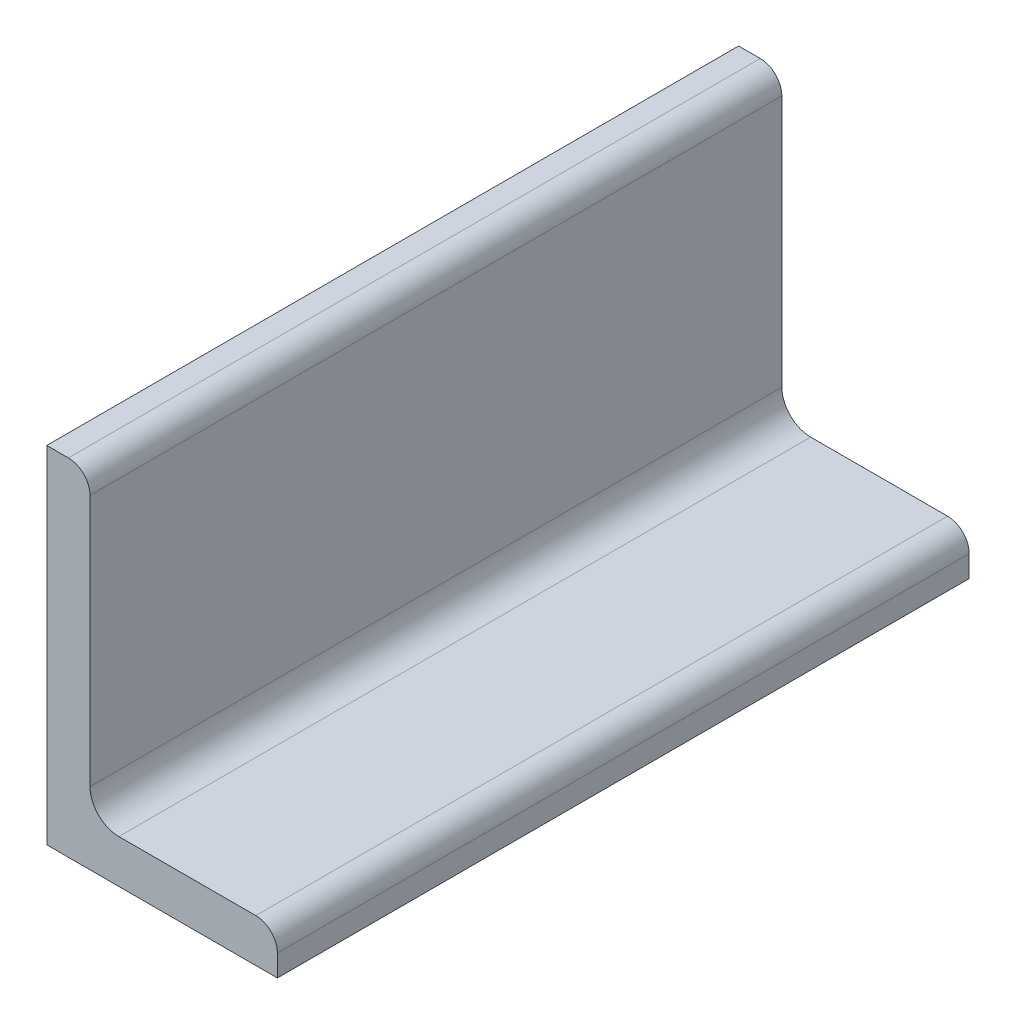
ISO-10303-21;
HEADER;
FILE_DESCRIPTION(('STEP AP214'),'2;1');
FILE_NAME('part.step','',(''),(''),'','','');
FILE_SCHEMA(('AUTOMOTIVE_DESIGN { 1 0 10303 214 1 1 1 1 }'));
ENDSEC;
DATA;
#1=APPLICATION_CONTEXT('core data for automotive mechanical design processes');
#2=APPLICATION_PROTOCOL_DEFINITION('international standard','automotive_design',2000,#1);
#3=PRODUCT_CONTEXT('',#1,'mechanical');
#4=PRODUCT('Part','Part','',(#3));
#5=PRODUCT_RELATED_PRODUCT_CATEGORY('part','',(#4));
#6=PRODUCT_DEFINITION_FORMATION('','',#4);
#7=PRODUCT_DEFINITION_CONTEXT('part definition',#1,'design');
#8=PRODUCT_DEFINITION('design','',#6,#7);
#9=PRODUCT_DEFINITION_SHAPE('','',#8);
#10=(LENGTH_UNIT() NAMED_UNIT(*) SI_UNIT(.MILLI.,.METRE.));
#11=(NAMED_UNIT(*) PLANE_ANGLE_UNIT() SI_UNIT($,.RADIAN.));
#12=(NAMED_UNIT(*) SI_UNIT($,.STERADIAN.) SOLID_ANGLE_UNIT());
#13=UNCERTAINTY_MEASURE_WITH_UNIT(LENGTH_MEASURE(1.E-05),#10,'distance_accuracy_value','');
#14=(GEOMETRIC_REPRESENTATION_CONTEXT(3) GLOBAL_UNCERTAINTY_ASSIGNED_CONTEXT((#13)) GLOBAL_UNIT_ASSIGNED_CONTEXT((#10,
#11,#12)) REPRESENTATION_CONTEXT('',''));
#15=CARTESIAN_POINT('',(0.,0.,0.));
#16=DIRECTION('',(0.,0.,1.));
#17=DIRECTION('',(1.,0.,0.));
#18=AXIS2_PLACEMENT_3D('',#15,#16,#17);
#19=CARTESIAN_POINT('',(0.865045893659089,152.925428131371,304.8));
#20=DIRECTION('',(1.,0.,0.));
#21=DIRECTION('',(0.,0.,-1.));
#22=AXIS2_PLACEMENT_3D('',#19,#20,#21);
#23=PLANE('',#22);
#24=DIRECTION('',(0.,-1.,0.));
#25=VECTOR('',#24,1.);
#26=CARTESIAN_POINT('',(0.865045893659089,152.925428131371,0.));
#27=LINE('',#26,#25);
#28=CARTESIAN_POINT('',(0.865045893659089,152.925428131371,0.));
#29=VERTEX_POINT('',#28);
#30=CARTESIAN_POINT('',(0.865045893659089,0.525428131371291,0.));
#31=VERTEX_POINT('',#30);
#32=EDGE_CURVE('E135',#29,#31,#27,.T.);
#33=ORIENTED_EDGE('',*,*,#32,.T.);
#34=DIRECTION('',(0.,0.,-1.));
#35=VECTOR('',#34,1.);
#36=CARTESIAN_POINT('',(0.865045893659089,0.525428131371291,304.8));
#37=LINE('',#36,#35);
#38=CARTESIAN_POINT('',(0.865045893659089,0.525428131371291,304.8));
#39=VERTEX_POINT('',#38);
#40=EDGE_CURVE('E11',#39,#31,#37,.T.);
#41=ORIENTED_EDGE('',*,*,#40,.F.);
#42=DIRECTION('',(0.,-1.,0.));
#43=VECTOR('',#42,1.);
#44=CARTESIAN_POINT('',(0.865045893659089,152.925428131371,304.8));
#45=LINE('',#44,#43);
#46=CARTESIAN_POINT('',(0.865045893659089,152.925428131371,304.8));
#47=VERTEX_POINT('',#46);
#48=EDGE_CURVE('E151',#47,#39,#45,.T.);
#49=ORIENTED_EDGE('',*,*,#48,.F.);
#50=DIRECTION('',(0.,0.,-1.));
#51=VECTOR('',#50,1.);
#52=CARTESIAN_POINT('',(0.865045893659089,152.925428131371,304.8));
#53=LINE('',#52,#51);
#54=EDGE_CURVE('E131',#47,#29,#53,.T.);
#55=ORIENTED_EDGE('',*,*,#54,.T.);
#56=EDGE_LOOP('',(#33,#41,#49,#55));
#57=FACE_BOUND('',#56,.T.);
#58=ADVANCED_FACE('F33',(#57),#23,.F.);
#59=CARTESIAN_POINT('',(0.865045893659089,0.525428131371291,304.8));
#60=DIRECTION('',(0.,1.,0.));
#61=DIRECTION('',(0.,0.,1.));
#62=AXIS2_PLACEMENT_3D('',#59,#60,#61);
#63=PLANE('',#62);
#64=DIRECTION('',(1.,0.,0.));
#65=VECTOR('',#64,1.);
#66=CARTESIAN_POINT('',(0.865045893659089,0.525428131371291,0.));
#67=LINE('',#66,#65);
#68=CARTESIAN_POINT('',(102.465045893659,0.525428131371291,0.));
#69=VERTEX_POINT('',#68);
#70=EDGE_CURVE('E138',#31,#69,#67,.T.);
#71=ORIENTED_EDGE('',*,*,#70,.T.);
#72=DIRECTION('',(0.,0.,-1.));
#73=VECTOR('',#72,1.);
#74=CARTESIAN_POINT('',(102.465045893659,0.525428131371291,304.8));
#75=LINE('',#74,#73);
#76=CARTESIAN_POINT('',(102.465045893659,0.525428131371291,304.8));
#77=VERTEX_POINT('',#76);
#78=EDGE_CURVE('E41',#77,#69,#75,.T.);
#79=ORIENTED_EDGE('',*,*,#78,.F.);
#80=DIRECTION('',(1.,0.,0.));
#81=VECTOR('',#80,1.);
#82=CARTESIAN_POINT('',(0.865045893659089,0.525428131371291,304.8));
#83=LINE('',#82,#81);
#84=EDGE_CURVE('E95',#39,#77,#83,.T.);
#85=ORIENTED_EDGE('',*,*,#84,.F.);
#86=ORIENTED_EDGE('',*,*,#40,.T.);
#87=EDGE_LOOP('',(#71,#79,#85,#86));
#88=FACE_BOUND('',#87,.T.);
#89=ADVANCED_FACE('F194',(#88),#63,.F.);
#90=CARTESIAN_POINT('',(102.465045893659,0.525428131371291,304.8));
#91=DIRECTION('',(-1.,0.,0.));
#92=DIRECTION('',(0.,0.,1.));
#93=AXIS2_PLACEMENT_3D('',#90,#91,#92);
#94=PLANE('',#93);
#95=DIRECTION('',(0.,1.,0.));
#96=VECTOR('',#95,1.);
#97=CARTESIAN_POINT('',(102.465045893659,0.525428131371291,0.));
#98=LINE('',#97,#96);
#99=CARTESIAN_POINT('',(102.465045893659,10.0504281313713,0.));
#100=VERTEX_POINT('',#99);
#101=EDGE_CURVE('E140',#69,#100,#98,.T.);
#102=ORIENTED_EDGE('',*,*,#101,.T.);
#103=DIRECTION('',(0.,0.,-1.));
#104=VECTOR('',#103,1.);
#105=CARTESIAN_POINT('',(102.465045893659,10.0504281313713,304.8));
#106=LINE('',#105,#104);
#107=CARTESIAN_POINT('',(102.465045893659,10.0504281313713,304.8));
#108=VERTEX_POINT('',#107);
#109=EDGE_CURVE('E161',#108,#100,#106,.T.);
#110=ORIENTED_EDGE('',*,*,#109,.F.);
#111=DIRECTION('',(0.,1.,0.));
#112=VECTOR('',#111,1.);
#113=CARTESIAN_POINT('',(102.465045893659,0.525428131371291,304.8));
#114=LINE('',#113,#112);
#115=EDGE_CURVE('E169',#77,#108,#114,.T.);
#116=ORIENTED_EDGE('',*,*,#115,.F.);
#117=ORIENTED_EDGE('',*,*,#78,.T.);
#118=EDGE_LOOP('',(#102,#110,#116,#117));
#119=FACE_BOUND('',#118,.T.);
#120=ADVANCED_FACE('F167',(#119),#94,.F.);
#121=CARTESIAN_POINT('',(92.9400458936591,10.0504281313713,304.8));
#122=DIRECTION('',(0.,0.,-1.));
#123=DIRECTION('',(-1.,0.,0.));
#124=AXIS2_PLACEMENT_3D('',#121,#122,#123);
#125=CYLINDRICAL_SURFACE('',#124,9.52500000000001);
#126=CARTESIAN_POINT('',(92.9400458936591,10.0504281313713,0.));
#127=DIRECTION('',(0.,0.,1.));
#128=DIRECTION('',(1.,0.,0.));
#129=AXIS2_PLACEMENT_3D('',#126,#127,#128);
#130=CIRCLE('',#129,9.52500000000001);
#131=CARTESIAN_POINT('',(92.9400458936591,19.5754281313713,0.));
#132=VERTEX_POINT('',#131);
#133=EDGE_CURVE('E142',#100,#132,#130,.T.);
#134=ORIENTED_EDGE('',*,*,#133,.T.);
#135=DIRECTION('',(0.,0.,-1.));
#136=VECTOR('',#135,1.);
#137=CARTESIAN_POINT('',(92.9400458936591,19.5754281313713,304.8));
#138=LINE('',#137,#136);
#139=CARTESIAN_POINT('',(92.9400458936591,19.5754281313713,304.8));
#140=VERTEX_POINT('',#139);
#141=EDGE_CURVE('E158',#140,#132,#138,.T.);
#142=ORIENTED_EDGE('',*,*,#141,.F.);
#143=CARTESIAN_POINT('',(92.9400458936591,10.0504281313713,304.8));
#144=DIRECTION('',(0.,0.,1.));
#145=DIRECTION('',(1.,0.,0.));
#146=AXIS2_PLACEMENT_3D('',#143,#144,#145);
#147=CIRCLE('',#146,9.52500000000001);
#148=EDGE_CURVE('E185',#108,#140,#147,.T.);
#149=ORIENTED_EDGE('',*,*,#148,.F.);
#150=ORIENTED_EDGE('',*,*,#109,.T.);
#151=EDGE_LOOP('',(#134,#142,#149,#150));
#152=FACE_BOUND('',#151,.T.);
#153=ADVANCED_FACE('F178',(#152),#125,.T.);
#154=CARTESIAN_POINT('',(92.9400458936591,19.5754281313713,304.8));
#155=DIRECTION('',(0.,-1.,0.));
#156=DIRECTION('',(0.,0.,-1.));
#157=AXIS2_PLACEMENT_3D('',#154,#155,#156);
#158=PLANE('',#157);
#159=DIRECTION('',(-1.,0.,0.));
#160=VECTOR('',#159,1.);
#161=CARTESIAN_POINT('',(92.9400458936591,19.5754281313713,0.));
#162=LINE('',#161,#160);
#163=CARTESIAN_POINT('',(32.6150458936591,19.5754281313713,0.));
#164=VERTEX_POINT('',#163);
#165=EDGE_CURVE('E144',#132,#164,#162,.T.);
#166=ORIENTED_EDGE('',*,*,#165,.T.);
#167=DIRECTION('',(0.,0.,-1.));
#168=VECTOR('',#167,1.);
#169=CARTESIAN_POINT('',(32.6150458936591,19.5754281313713,304.8));
#170=LINE('',#169,#168);
#171=CARTESIAN_POINT('',(32.6150458936591,19.5754281313713,304.8));
#172=VERTEX_POINT('',#171);
#173=EDGE_CURVE('E155',#172,#164,#170,.T.);
#174=ORIENTED_EDGE('',*,*,#173,.F.);
#175=DIRECTION('',(-1.,0.,0.));
#176=VECTOR('',#175,1.);
#177=CARTESIAN_POINT('',(92.9400458936591,19.5754281313713,304.8));
#178=LINE('',#177,#176);
#179=EDGE_CURVE('E184',#140,#172,#178,.T.);
#180=ORIENTED_EDGE('',*,*,#179,.F.);
#181=ORIENTED_EDGE('',*,*,#141,.T.);
#182=EDGE_LOOP('',(#166,#174,#180,#181));
#183=FACE_BOUND('',#182,.T.);
#184=ADVANCED_FACE('F182',(#183),#158,.F.);
#185=CARTESIAN_POINT('',(32.6150458936591,32.2754281313713,304.8));
#186=DIRECTION('',(0.,0.,-1.));
#187=DIRECTION('',(-1.,0.,0.));
#188=AXIS2_PLACEMENT_3D('',#185,#186,#187);
#189=CYLINDRICAL_SURFACE('',#188,12.7);
#190=CARTESIAN_POINT('',(32.6150458936591,32.2754281313713,0.));
#191=DIRECTION('',(0.,0.,-1.));
#192=DIRECTION('',(1.,0.,0.));
#193=AXIS2_PLACEMENT_3D('',#190,#191,#192);
#194=CIRCLE('',#193,12.7);
#195=CARTESIAN_POINT('',(19.9150458936591,32.2754281313713,0.));
#196=VERTEX_POINT('',#195);
#197=EDGE_CURVE('E146',#164,#196,#194,.T.);
#198=ORIENTED_EDGE('',*,*,#197,.T.);
#199=DIRECTION('',(0.,0.,-1.));
#200=VECTOR('',#199,1.);
#201=CARTESIAN_POINT('',(19.9150458936591,32.2754281313713,304.8));
#202=LINE('',#201,#200);
#203=CARTESIAN_POINT('',(19.9150458936591,32.2754281313713,304.8));
#204=VERTEX_POINT('',#203);
#205=EDGE_CURVE('E126',#204,#196,#202,.T.);
#206=ORIENTED_EDGE('',*,*,#205,.F.);
#207=CARTESIAN_POINT('',(32.6150458936591,32.2754281313713,304.8));
#208=DIRECTION('',(0.,0.,-1.));
#209=DIRECTION('',(1.,0.,0.));
#210=AXIS2_PLACEMENT_3D('',#207,#208,#209);
#211=CIRCLE('',#210,12.7);
#212=EDGE_CURVE('E117',#172,#204,#211,.T.);
#213=ORIENTED_EDGE('',*,*,#212,.F.);
#214=ORIENTED_EDGE('',*,*,#173,.T.);
#215=EDGE_LOOP('',(#198,#206,#213,#214));
#216=FACE_BOUND('',#215,.T.);
#217=ADVANCED_FACE('F206',(#216),#189,.F.);
#218=CARTESIAN_POINT('',(19.9150458936591,32.2754281313713,304.8));
#219=DIRECTION('',(-1.,0.,0.));
#220=DIRECTION('',(0.,0.,1.));
#221=AXIS2_PLACEMENT_3D('',#218,#219,#220);
#222=PLANE('',#221);
#223=DIRECTION('',(0.,1.,0.));
#224=VECTOR('',#223,1.);
#225=CARTESIAN_POINT('',(19.9150458936591,32.2754281313713,0.));
#226=LINE('',#225,#224);
#227=CARTESIAN_POINT('',(19.9150458936591,143.400428131371,0.));
#228=VERTEX_POINT('',#227);
#229=EDGE_CURVE('E125',#196,#228,#226,.T.);
#230=ORIENTED_EDGE('',*,*,#229,.T.);
#231=DIRECTION('',(0.,0.,-1.));
#232=VECTOR('',#231,1.);
#233=CARTESIAN_POINT('',(19.9150458936591,143.400428131371,304.8));
#234=LINE('',#233,#232);
#235=CARTESIAN_POINT('',(19.9150458936591,143.400428131371,304.8));
#236=VERTEX_POINT('',#235);
#237=EDGE_CURVE('E122',#236,#228,#234,.T.);
#238=ORIENTED_EDGE('',*,*,#237,.F.);
#239=DIRECTION('',(0.,1.,0.));
#240=VECTOR('',#239,1.);
#241=CARTESIAN_POINT('',(19.9150458936591,32.2754281313713,304.8));
#242=LINE('',#241,#240);
#243=EDGE_CURVE('E111',#204,#236,#242,.T.);
#244=ORIENTED_EDGE('',*,*,#243,.F.);
#245=ORIENTED_EDGE('',*,*,#205,.T.);
#246=EDGE_LOOP('',(#230,#238,#244,#245));
#247=FACE_BOUND('',#246,.T.);
#248=ADVANCED_FACE('F123',(#247),#222,.F.);
#249=CARTESIAN_POINT('',(10.3900458936591,143.400428131371,304.8));
#250=DIRECTION('',(0.,0.,-1.));
#251=DIRECTION('',(-1.,0.,0.));
#252=AXIS2_PLACEMENT_3D('',#249,#250,#251);
#253=CYLINDRICAL_SURFACE('',#252,9.525);
#254=CARTESIAN_POINT('',(10.3900458936591,143.400428131371,0.));
#255=DIRECTION('',(0.,0.,1.));
#256=DIRECTION('',(1.,0.,0.));
#257=AXIS2_PLACEMENT_3D('',#254,#255,#256);
#258=CIRCLE('',#257,9.525);
#259=CARTESIAN_POINT('',(10.3900458936591,152.925428131371,0.));
#260=VERTEX_POINT('',#259);
#261=EDGE_CURVE('E81',#228,#260,#258,.T.);
#262=ORIENTED_EDGE('',*,*,#261,.T.);
#263=DIRECTION('',(0.,0.,-1.));
#264=VECTOR('',#263,1.);
#265=CARTESIAN_POINT('',(10.3900458936591,152.925428131371,304.8));
#266=LINE('',#265,#264);
#267=CARTESIAN_POINT('',(10.3900458936591,152.925428131371,304.8));
#268=VERTEX_POINT('',#267);
#269=EDGE_CURVE('E127',#268,#260,#266,.T.);
#270=ORIENTED_EDGE('',*,*,#269,.F.);
#271=CARTESIAN_POINT('',(10.3900458936591,143.400428131371,304.8));
#272=DIRECTION('',(0.,0.,1.));
#273=DIRECTION('',(1.,0.,0.));
#274=AXIS2_PLACEMENT_3D('',#271,#272,#273);
#275=CIRCLE('',#274,9.525);
#276=EDGE_CURVE('E115',#236,#268,#275,.T.);
#277=ORIENTED_EDGE('',*,*,#276,.F.);
#278=ORIENTED_EDGE('',*,*,#237,.T.);
#279=EDGE_LOOP('',(#262,#270,#277,#278));
#280=FACE_BOUND('',#279,.T.);
#281=ADVANCED_FACE('F129',(#280),#253,.T.);
#282=CARTESIAN_POINT('',(10.3900458936591,152.925428131371,304.8));
#283=DIRECTION('',(0.,-1.,0.));
#284=DIRECTION('',(0.,0.,-1.));
#285=AXIS2_PLACEMENT_3D('',#282,#283,#284);
#286=PLANE('',#285);
#287=DIRECTION('',(-1.,0.,0.));
#288=VECTOR('',#287,1.);
#289=CARTESIAN_POINT('',(10.3900458936591,152.925428131371,0.));
#290=LINE('',#289,#288);
#291=EDGE_CURVE('E87',#260,#29,#290,.T.);
#292=ORIENTED_EDGE('',*,*,#291,.T.);
#293=ORIENTED_EDGE('',*,*,#54,.F.);
#294=DIRECTION('',(-1.,0.,0.));
#295=VECTOR('',#294,1.);
#296=CARTESIAN_POINT('',(10.3900458936591,152.925428131371,304.8));
#297=LINE('',#296,#295);
#298=EDGE_CURVE('E49',#268,#47,#297,.T.);
#299=ORIENTED_EDGE('',*,*,#298,.F.);
#300=ORIENTED_EDGE('',*,*,#269,.T.);
#301=EDGE_LOOP('',(#292,#293,#299,#300));
#302=FACE_BOUND('',#301,.T.);
#303=ADVANCED_FACE('F214',(#302),#286,.F.);
#304=CARTESIAN_POINT('',(92.9400458936591,10.0504281313713,304.8));
#305=DIRECTION('',(0.,0.,1.));
#306=DIRECTION('',(1.,0.,0.));
#307=AXIS2_PLACEMENT_3D('',#304,#305,#306);
#308=PLANE('',#307);
#309=ORIENTED_EDGE('',*,*,#48,.T.);
#310=ORIENTED_EDGE('',*,*,#84,.T.);
#311=ORIENTED_EDGE('',*,*,#115,.T.);
#312=ORIENTED_EDGE('',*,*,#148,.T.);
#313=ORIENTED_EDGE('',*,*,#179,.T.);
#314=ORIENTED_EDGE('',*,*,#212,.T.);
#315=ORIENTED_EDGE('',*,*,#243,.T.);
#316=ORIENTED_EDGE('',*,*,#276,.T.);
#317=ORIENTED_EDGE('',*,*,#298,.T.);
#318=EDGE_LOOP('',(#309,#310,#311,#312,#313,#314,#315,#316,#317));
#319=FACE_BOUND('',#318,.T.);
#320=ADVANCED_FACE('F113',(#319),#308,.T.);
#321=CARTESIAN_POINT('',(92.9400458936591,10.0504281313713,0.));
#322=DIRECTION('',(0.,0.,1.));
#323=DIRECTION('',(1.,0.,0.));
#324=AXIS2_PLACEMENT_3D('',#321,#322,#323);
#325=PLANE('',#324);
#326=ORIENTED_EDGE('',*,*,#32,.F.);
#327=ORIENTED_EDGE('',*,*,#291,.F.);
#328=ORIENTED_EDGE('',*,*,#261,.F.);
#329=ORIENTED_EDGE('',*,*,#229,.F.);
#330=ORIENTED_EDGE('',*,*,#197,.F.);
#331=ORIENTED_EDGE('',*,*,#165,.F.);
#332=ORIENTED_EDGE('',*,*,#133,.F.);
#333=ORIENTED_EDGE('',*,*,#101,.F.);
#334=ORIENTED_EDGE('',*,*,#70,.F.);
#335=EDGE_LOOP('',(#326,#327,#328,#329,#330,#331,#332,#333,#334));
#336=FACE_BOUND('',#335,.T.);
#337=ADVANCED_FACE('F173',(#336),#325,.F.);
#338=CLOSED_SHELL('',(#58,#89,#120,#153,#184,#217,#248,#281,#303,#320,#337));
#339=MANIFOLD_SOLID_BREP('B2',#338);
#340=ADVANCED_BREP_SHAPE_REPRESENTATION('',(#18,#339),#14);
#341=SHAPE_DEFINITION_REPRESENTATION(#9,#340);
ENDSEC;
END-ISO-10303-21;
